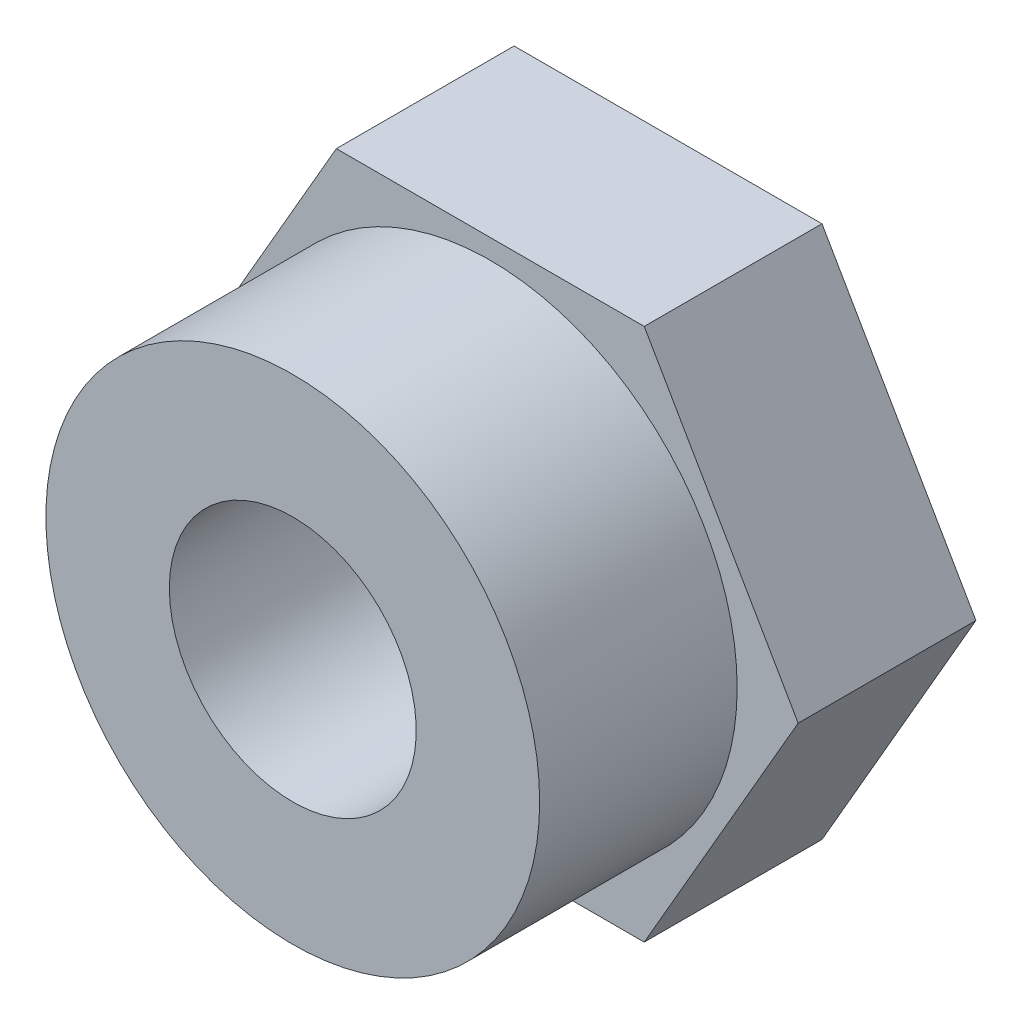
ISO-10303-21;
HEADER;
FILE_DESCRIPTION(('STEP AP214'),'2;1');
FILE_NAME('part.step','',(''),(''),'','','');
FILE_SCHEMA(('AUTOMOTIVE_DESIGN { 1 0 10303 214 1 1 1 1 }'));
ENDSEC;
DATA;
#1=APPLICATION_CONTEXT('core data for automotive mechanical design processes');
#2=APPLICATION_PROTOCOL_DEFINITION('international standard','automotive_design',2000,#1);
#3=PRODUCT_CONTEXT('',#1,'mechanical');
#4=PRODUCT('Part','Part','',(#3));
#5=PRODUCT_RELATED_PRODUCT_CATEGORY('part','',(#4));
#6=PRODUCT_DEFINITION_FORMATION('','',#4);
#7=PRODUCT_DEFINITION_CONTEXT('part definition',#1,'design');
#8=PRODUCT_DEFINITION('design','',#6,#7);
#9=PRODUCT_DEFINITION_SHAPE('','',#8);
#10=(LENGTH_UNIT() NAMED_UNIT(*) SI_UNIT(.MILLI.,.METRE.));
#11=(NAMED_UNIT(*) PLANE_ANGLE_UNIT() SI_UNIT($,.RADIAN.));
#12=(NAMED_UNIT(*) SI_UNIT($,.STERADIAN.) SOLID_ANGLE_UNIT());
#13=UNCERTAINTY_MEASURE_WITH_UNIT(LENGTH_MEASURE(1.E-05),#10,'distance_accuracy_value','');
#14=(GEOMETRIC_REPRESENTATION_CONTEXT(3) GLOBAL_UNCERTAINTY_ASSIGNED_CONTEXT((#13)) GLOBAL_UNIT_ASSIGNED_CONTEXT((#10,
#11,#12)) REPRESENTATION_CONTEXT('',''));
#15=CARTESIAN_POINT('',(0.,0.,0.));
#16=DIRECTION('',(0.,0.,1.));
#17=DIRECTION('',(1.,0.,0.));
#18=AXIS2_PLACEMENT_3D('',#15,#16,#17);
#19=CARTESIAN_POINT('',(0.,0.,0.));
#20=DIRECTION('',(0.,0.,1.));
#21=DIRECTION('',(1.,0.,0.));
#22=AXIS2_PLACEMENT_3D('',#19,#20,#21);
#23=PLANE('',#22);
#24=CARTESIAN_POINT('',(0.,0.,0.));
#25=DIRECTION('',(0.,0.,-1.));
#26=DIRECTION('',(-1.,0.,0.));
#27=AXIS2_PLACEMENT_3D('',#24,#25,#26);
#28=CIRCLE('',#27,1.25);
#29=CARTESIAN_POINT('',(-1.25,0.,0.));
#30=VERTEX_POINT('',#29);
#31=EDGE_CURVE('E19',#30,#30,#28,.F.);
#32=ORIENTED_EDGE('',*,*,#31,.T.);
#33=EDGE_LOOP('',(#32));
#34=FACE_BOUND('',#33,.T.);
#35=DIRECTION('',(-0.5,0.866025403784439,0.));
#36=VECTOR('',#35,1.);
#37=CARTESIAN_POINT('',(-3.11769145362398,0.,0.));
#38=LINE('',#37,#36);
#39=CARTESIAN_POINT('',(-1.55884572681199,-2.7,0.));
#40=VERTEX_POINT('',#39);
#41=CARTESIAN_POINT('',(-3.11769145362398,0.,0.));
#42=VERTEX_POINT('',#41);
#43=EDGE_CURVE('E117',#40,#42,#38,.T.);
#44=ORIENTED_EDGE('',*,*,#43,.T.);
#45=DIRECTION('',(0.5,0.866025403784439,0.));
#46=VECTOR('',#45,1.);
#47=CARTESIAN_POINT('',(-1.55884572681199,2.7,0.));
#48=LINE('',#47,#46);
#49=CARTESIAN_POINT('',(-1.55884572681199,2.7,0.));
#50=VERTEX_POINT('',#49);
#51=EDGE_CURVE('E122',#42,#50,#48,.T.);
#52=ORIENTED_EDGE('',*,*,#51,.T.);
#53=DIRECTION('',(1.,0.,0.));
#54=VECTOR('',#53,1.);
#55=CARTESIAN_POINT('',(1.55884572681199,2.7,0.));
#56=LINE('',#55,#54);
#57=CARTESIAN_POINT('',(1.55884572681199,2.7,0.));
#58=VERTEX_POINT('',#57);
#59=EDGE_CURVE('E126',#50,#58,#56,.T.);
#60=ORIENTED_EDGE('',*,*,#59,.T.);
#61=DIRECTION('',(0.5,-0.866025403784439,0.));
#62=VECTOR('',#61,1.);
#63=CARTESIAN_POINT('',(3.11769145362398,0.,0.));
#64=LINE('',#63,#62);
#65=CARTESIAN_POINT('',(3.11769145362398,0.,0.));
#66=VERTEX_POINT('',#65);
#67=EDGE_CURVE('E67',#58,#66,#64,.T.);
#68=ORIENTED_EDGE('',*,*,#67,.T.);
#69=DIRECTION('',(-0.5,-0.866025403784439,0.));
#70=VECTOR('',#69,1.);
#71=CARTESIAN_POINT('',(1.55884572681199,-2.7,0.));
#72=LINE('',#71,#70);
#73=CARTESIAN_POINT('',(1.55884572681199,-2.7,0.));
#74=VERTEX_POINT('',#73);
#75=EDGE_CURVE('E69',#66,#74,#72,.T.);
#76=ORIENTED_EDGE('',*,*,#75,.T.);
#77=DIRECTION('',(-1.,0.,0.));
#78=VECTOR('',#77,1.);
#79=CARTESIAN_POINT('',(-1.55884572681199,-2.7,0.));
#80=LINE('',#79,#78);
#81=EDGE_CURVE('E71',#74,#40,#80,.T.);
#82=ORIENTED_EDGE('',*,*,#81,.T.);
#83=EDGE_LOOP('',(#44,#52,#60,#68,#76,#82));
#84=FACE_BOUND('',#83,.T.);
#85=ADVANCED_FACE('F16',(#34,#84),#23,.F.);
#86=CARTESIAN_POINT('',(-1.55884572681199,-2.7,3.8));
#87=DIRECTION('',(0.,1.,0.));
#88=DIRECTION('',(-1.,0.,0.));
#89=AXIS2_PLACEMENT_3D('',#86,#87,#88);
#90=PLANE('',#89);
#91=DIRECTION('',(0.,0.,1.));
#92=VECTOR('',#91,1.);
#93=CARTESIAN_POINT('',(-1.55884572681199,-2.7,3.8));
#94=LINE('',#93,#92);
#95=CARTESIAN_POINT('',(-1.55884572681199,-2.7,1.8));
#96=VERTEX_POINT('',#95);
#97=EDGE_CURVE('E82',#96,#40,#94,.F.);
#98=ORIENTED_EDGE('',*,*,#97,.T.);
#99=ORIENTED_EDGE('',*,*,#81,.F.);
#100=DIRECTION('',(0.,0.,1.));
#101=VECTOR('',#100,1.);
#102=CARTESIAN_POINT('',(1.55884572681199,-2.7,3.8));
#103=LINE('',#102,#101);
#104=CARTESIAN_POINT('',(1.55884572681199,-2.7,1.8));
#105=VERTEX_POINT('',#104);
#106=EDGE_CURVE('E76',#74,#105,#103,.T.);
#107=ORIENTED_EDGE('',*,*,#106,.T.);
#108=DIRECTION('',(1.,0.,0.));
#109=VECTOR('',#108,1.);
#110=CARTESIAN_POINT('',(0.,-2.7,1.8));
#111=LINE('',#110,#109);
#112=EDGE_CURVE('E114',#96,#105,#111,.T.);
#113=ORIENTED_EDGE('',*,*,#112,.F.);
#114=EDGE_LOOP('',(#98,#99,#107,#113));
#115=FACE_BOUND('',#114,.T.);
#116=ADVANCED_FACE('F79',(#115),#90,.F.);
#117=CARTESIAN_POINT('',(1.55884572681199,-2.7,3.8));
#118=DIRECTION('',(-0.866025403784439,0.5,0.));
#119=DIRECTION('',(-0.5,-0.866025403784439,0.));
#120=AXIS2_PLACEMENT_3D('',#117,#118,#119);
#121=PLANE('',#120);
#122=ORIENTED_EDGE('',*,*,#106,.F.);
#123=ORIENTED_EDGE('',*,*,#75,.F.);
#124=DIRECTION('',(0.,0.,1.));
#125=VECTOR('',#124,1.);
#126=CARTESIAN_POINT('',(3.11769145362398,0.,3.8));
#127=LINE('',#126,#125);
#128=CARTESIAN_POINT('',(3.11769145362398,0.,1.8));
#129=VERTEX_POINT('',#128);
#130=EDGE_CURVE('E90',#66,#129,#127,.T.);
#131=ORIENTED_EDGE('',*,*,#130,.T.);
#132=DIRECTION('',(0.5,0.866025403784439,0.));
#133=VECTOR('',#132,1.);
#134=CARTESIAN_POINT('',(1.55884572681199,-2.7,1.8));
#135=LINE('',#134,#133);
#136=EDGE_CURVE('E87',#105,#129,#135,.T.);
#137=ORIENTED_EDGE('',*,*,#136,.F.);
#138=EDGE_LOOP('',(#122,#123,#131,#137));
#139=FACE_BOUND('',#138,.T.);
#140=ADVANCED_FACE('F85',(#139),#121,.F.);
#141=CARTESIAN_POINT('',(3.11769145362398,0.,3.8));
#142=DIRECTION('',(-0.866025403784439,-0.5,0.));
#143=DIRECTION('',(0.5,-0.866025403784439,0.));
#144=AXIS2_PLACEMENT_3D('',#141,#142,#143);
#145=PLANE('',#144);
#146=ORIENTED_EDGE('',*,*,#130,.F.);
#147=ORIENTED_EDGE('',*,*,#67,.F.);
#148=DIRECTION('',(0.,0.,1.));
#149=VECTOR('',#148,1.);
#150=CARTESIAN_POINT('',(1.55884572681199,2.7,3.8));
#151=LINE('',#150,#149);
#152=CARTESIAN_POINT('',(1.55884572681199,2.7,1.8));
#153=VERTEX_POINT('',#152);
#154=EDGE_CURVE('E124',#58,#153,#151,.T.);
#155=ORIENTED_EDGE('',*,*,#154,.T.);
#156=DIRECTION('',(-0.5,0.866025403784439,0.));
#157=VECTOR('',#156,1.);
#158=CARTESIAN_POINT('',(3.11769145362398,0.,1.8));
#159=LINE('',#158,#157);
#160=EDGE_CURVE('E110',#129,#153,#159,.T.);
#161=ORIENTED_EDGE('',*,*,#160,.F.);
#162=EDGE_LOOP('',(#146,#147,#155,#161));
#163=FACE_BOUND('',#162,.T.);
#164=ADVANCED_FACE('F129',(#163),#145,.F.);
#165=CARTESIAN_POINT('',(1.55884572681199,2.7,3.8));
#166=DIRECTION('',(0.,-1.,0.));
#167=DIRECTION('',(1.,0.,0.));
#168=AXIS2_PLACEMENT_3D('',#165,#166,#167);
#169=PLANE('',#168);
#170=ORIENTED_EDGE('',*,*,#154,.F.);
#171=ORIENTED_EDGE('',*,*,#59,.F.);
#172=DIRECTION('',(0.,0.,1.));
#173=VECTOR('',#172,1.);
#174=CARTESIAN_POINT('',(-1.55884572681199,2.7,3.8));
#175=LINE('',#174,#173);
#176=CARTESIAN_POINT('',(-1.55884572681199,2.7,1.8));
#177=VERTEX_POINT('',#176);
#178=EDGE_CURVE('E120',#50,#177,#175,.T.);
#179=ORIENTED_EDGE('',*,*,#178,.T.);
#180=DIRECTION('',(1.,0.,0.));
#181=VECTOR('',#180,1.);
#182=CARTESIAN_POINT('',(0.,2.7,1.8));
#183=LINE('',#182,#181);
#184=EDGE_CURVE('E105',#153,#177,#183,.F.);
#185=ORIENTED_EDGE('',*,*,#184,.F.);
#186=EDGE_LOOP('',(#170,#171,#179,#185));
#187=FACE_BOUND('',#186,.T.);
#188=ADVANCED_FACE('F140',(#187),#169,.F.);
#189=CARTESIAN_POINT('',(-1.55884572681199,2.7,3.8));
#190=DIRECTION('',(0.866025403784439,-0.5,0.));
#191=DIRECTION('',(0.5,0.866025403784439,0.));
#192=AXIS2_PLACEMENT_3D('',#189,#190,#191);
#193=PLANE('',#192);
#194=ORIENTED_EDGE('',*,*,#178,.F.);
#195=ORIENTED_EDGE('',*,*,#51,.F.);
#196=DIRECTION('',(0.,0.,1.));
#197=VECTOR('',#196,1.);
#198=CARTESIAN_POINT('',(-3.11769145362398,0.,3.8));
#199=LINE('',#198,#197);
#200=CARTESIAN_POINT('',(-3.11769145362398,0.,1.8));
#201=VERTEX_POINT('',#200);
#202=EDGE_CURVE('E34',#42,#201,#199,.T.);
#203=ORIENTED_EDGE('',*,*,#202,.T.);
#204=DIRECTION('',(-0.5,-0.866025403784439,0.));
#205=VECTOR('',#204,1.);
#206=CARTESIAN_POINT('',(-1.55884572681199,2.7,1.8));
#207=LINE('',#206,#205);
#208=EDGE_CURVE('E101',#177,#201,#207,.T.);
#209=ORIENTED_EDGE('',*,*,#208,.F.);
#210=EDGE_LOOP('',(#194,#195,#203,#209));
#211=FACE_BOUND('',#210,.T.);
#212=ADVANCED_FACE('F138',(#211),#193,.F.);
#213=CARTESIAN_POINT('',(-3.11769145362398,0.,3.8));
#214=DIRECTION('',(0.866025403784439,0.5,0.));
#215=DIRECTION('',(-0.5,0.866025403784439,0.));
#216=AXIS2_PLACEMENT_3D('',#213,#214,#215);
#217=PLANE('',#216);
#218=ORIENTED_EDGE('',*,*,#202,.F.);
#219=ORIENTED_EDGE('',*,*,#43,.F.);
#220=ORIENTED_EDGE('',*,*,#97,.F.);
#221=DIRECTION('',(0.5,-0.866025403784439,0.));
#222=VECTOR('',#221,1.);
#223=CARTESIAN_POINT('',(-3.11769145362398,0.,1.8));
#224=LINE('',#223,#222);
#225=EDGE_CURVE('E97',#201,#96,#224,.T.);
#226=ORIENTED_EDGE('',*,*,#225,.F.);
#227=EDGE_LOOP('',(#218,#219,#220,#226));
#228=FACE_BOUND('',#227,.T.);
#229=ADVANCED_FACE('F135',(#228),#217,.F.);
#230=CARTESIAN_POINT('',(0.,0.,3.8));
#231=DIRECTION('',(0.,0.,-1.));
#232=DIRECTION('',(-1.,0.,0.));
#233=AXIS2_PLACEMENT_3D('',#230,#231,#232);
#234=CYLINDRICAL_SURFACE('',#233,1.25);
#235=ORIENTED_EDGE('',*,*,#31,.F.);
#236=EDGE_LOOP('',(#235));
#237=FACE_BOUND('',#236,.T.);
#238=CARTESIAN_POINT('',(0.,0.,3.8));
#239=DIRECTION('',(0.,0.,-1.));
#240=DIRECTION('',(-1.,0.,0.));
#241=AXIS2_PLACEMENT_3D('',#238,#239,#240);
#242=CIRCLE('',#241,1.25);
#243=CARTESIAN_POINT('',(-1.25,0.,3.8));
#244=VERTEX_POINT('',#243);
#245=EDGE_CURVE('E95',#244,#244,#242,.T.);
#246=ORIENTED_EDGE('',*,*,#245,.F.);
#247=EDGE_LOOP('',(#246));
#248=FACE_BOUND('',#247,.T.);
#249=ADVANCED_FACE('F164',(#237,#248),#234,.F.);
#250=CARTESIAN_POINT('',(0.,0.,1.8));
#251=DIRECTION('',(0.,0.,1.));
#252=DIRECTION('',(1.,0.,0.));
#253=AXIS2_PLACEMENT_3D('',#250,#251,#252);
#254=PLANE('',#253);
#255=ORIENTED_EDGE('',*,*,#208,.T.);
#256=ORIENTED_EDGE('',*,*,#225,.T.);
#257=ORIENTED_EDGE('',*,*,#112,.T.);
#258=ORIENTED_EDGE('',*,*,#136,.T.);
#259=ORIENTED_EDGE('',*,*,#160,.T.);
#260=ORIENTED_EDGE('',*,*,#184,.T.);
#261=EDGE_LOOP('',(#255,#256,#257,#258,#259,#260));
#262=FACE_BOUND('',#261,.T.);
#263=CARTESIAN_POINT('',(0.,0.,1.8));
#264=DIRECTION('',(0.,0.,1.));
#265=DIRECTION('',(1.,0.,0.));
#266=AXIS2_PLACEMENT_3D('',#263,#264,#265);
#267=CIRCLE('',#266,2.5);
#268=CARTESIAN_POINT('',(2.5,0.,1.8));
#269=VERTEX_POINT('',#268);
#270=EDGE_CURVE('E25',#269,#269,#267,.T.);
#271=ORIENTED_EDGE('',*,*,#270,.F.);
#272=EDGE_LOOP('',(#271));
#273=FACE_BOUND('',#272,.T.);
#274=ADVANCED_FACE('F132',(#262,#273),#254,.T.);
#275=CARTESIAN_POINT('',(0.,0.,3.8));
#276=DIRECTION('',(0.,0.,1.));
#277=DIRECTION('',(1.,0.,0.));
#278=AXIS2_PLACEMENT_3D('',#275,#276,#277);
#279=PLANE('',#278);
#280=CARTESIAN_POINT('',(0.,0.,3.8));
#281=DIRECTION('',(0.,0.,1.));
#282=DIRECTION('',(1.,0.,0.));
#283=AXIS2_PLACEMENT_3D('',#280,#281,#282);
#284=CIRCLE('',#283,2.5);
#285=CARTESIAN_POINT('',(2.5,0.,3.8));
#286=VERTEX_POINT('',#285);
#287=EDGE_CURVE('E11',#286,#286,#284,.F.);
#288=ORIENTED_EDGE('',*,*,#287,.F.);
#289=EDGE_LOOP('',(#288));
#290=FACE_BOUND('',#289,.T.);
#291=ORIENTED_EDGE('',*,*,#245,.T.);
#292=EDGE_LOOP('',(#291));
#293=FACE_BOUND('',#292,.T.);
#294=ADVANCED_FACE('F152',(#290,#293),#279,.T.);
#295=CARTESIAN_POINT('',(0.,0.,1.8));
#296=DIRECTION('',(0.,0.,1.));
#297=DIRECTION('',(1.,0.,0.));
#298=AXIS2_PLACEMENT_3D('',#295,#296,#297);
#299=CYLINDRICAL_SURFACE('',#298,2.5);
#300=ORIENTED_EDGE('',*,*,#287,.T.);
#301=EDGE_LOOP('',(#300));
#302=FACE_BOUND('',#301,.T.);
#303=ORIENTED_EDGE('',*,*,#270,.T.);
#304=EDGE_LOOP('',(#303));
#305=FACE_BOUND('',#304,.T.);
#306=ADVANCED_FACE('F150',(#302,#305),#299,.T.);
#307=CLOSED_SHELL('',(#85,#116,#140,#164,#188,#212,#229,#249,#274,#294,#306));
#308=MANIFOLD_SOLID_BREP('B1',#307);
#309=ADVANCED_BREP_SHAPE_REPRESENTATION('',(#18,#308),#14);
#310=SHAPE_DEFINITION_REPRESENTATION(#9,#309);
ENDSEC;
END-ISO-10303-21;
